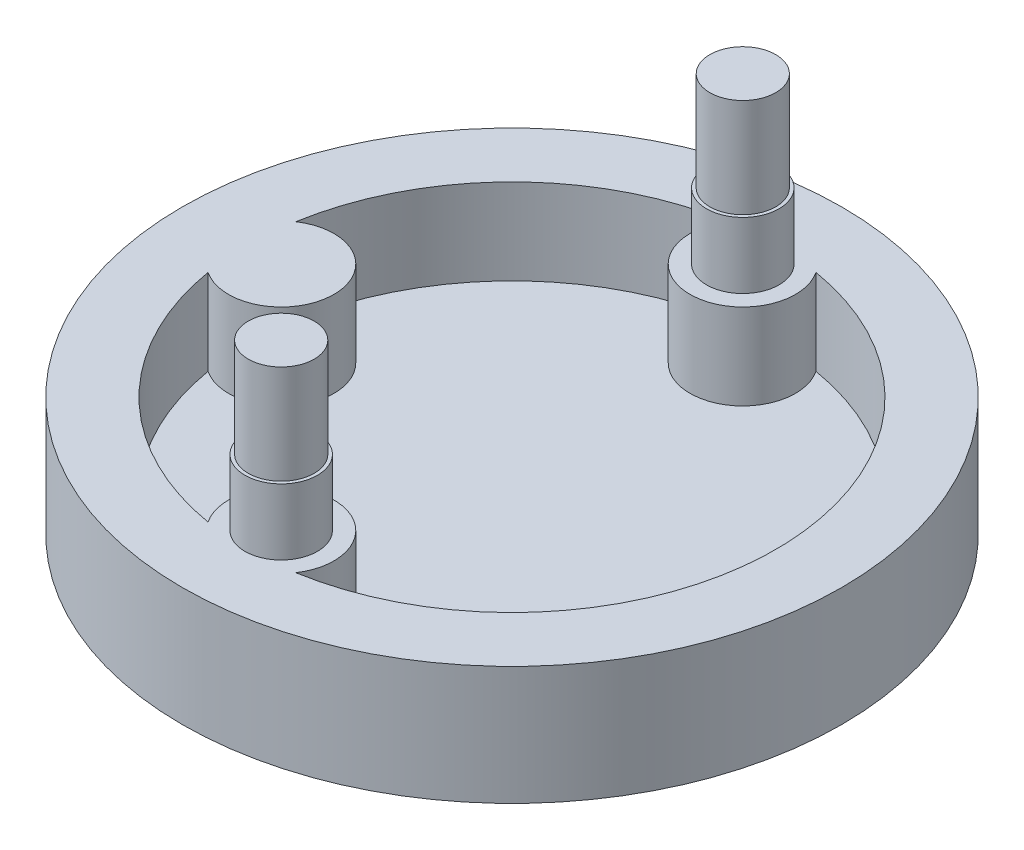
ISO-10303-21;
HEADER;
FILE_DESCRIPTION(('STEP AP214'),'2;1');
FILE_NAME('part.step','',(''),(''),'','','');
FILE_SCHEMA(('AUTOMOTIVE_DESIGN { 1 0 10303 214 1 1 1 1 }'));
ENDSEC;
DATA;
#1=APPLICATION_CONTEXT('core data for automotive mechanical design processes');
#2=APPLICATION_PROTOCOL_DEFINITION('international standard','automotive_design',2000,#1);
#3=PRODUCT_CONTEXT('',#1,'mechanical');
#4=PRODUCT('Part','Part','',(#3));
#5=PRODUCT_RELATED_PRODUCT_CATEGORY('part','',(#4));
#6=PRODUCT_DEFINITION_FORMATION('','',#4);
#7=PRODUCT_DEFINITION_CONTEXT('part definition',#1,'design');
#8=PRODUCT_DEFINITION('design','',#6,#7);
#9=PRODUCT_DEFINITION_SHAPE('','',#8);
#10=(LENGTH_UNIT() NAMED_UNIT(*) SI_UNIT(.MILLI.,.METRE.));
#11=(NAMED_UNIT(*) PLANE_ANGLE_UNIT() SI_UNIT($,.RADIAN.));
#12=(NAMED_UNIT(*) SI_UNIT($,.STERADIAN.) SOLID_ANGLE_UNIT());
#13=UNCERTAINTY_MEASURE_WITH_UNIT(LENGTH_MEASURE(1.E-05),#10,'distance_accuracy_value','');
#14=(GEOMETRIC_REPRESENTATION_CONTEXT(3) GLOBAL_UNCERTAINTY_ASSIGNED_CONTEXT((#13)) GLOBAL_UNIT_ASSIGNED_CONTEXT((#10,
#11,#12)) REPRESENTATION_CONTEXT('',''));
#15=CARTESIAN_POINT('',(0.,0.,0.));
#16=DIRECTION('',(0.,0.,1.));
#17=DIRECTION('',(1.,0.,0.));
#18=AXIS2_PLACEMENT_3D('',#15,#16,#17);
#19=CARTESIAN_POINT('',(0.,18.,0.));
#20=DIRECTION('',(0.,-1.,0.));
#21=DIRECTION('',(0.,0.,-1.));
#22=AXIS2_PLACEMENT_3D('',#19,#20,#21);
#23=CYLINDRICAL_SURFACE('',#22,40.);
#24=DIRECTION('',(0.,-1.,0.));
#25=VECTOR('',#24,1.);
#26=CARTESIAN_POINT('',(-39.4428571428571,11.5,-6.65289564085967));
#27=LINE('',#26,#25);
#28=CARTESIAN_POINT('',(-39.4428571428571,18.,-6.6528956408597));
#29=VERTEX_POINT('',#28);
#30=CARTESIAN_POINT('',(-39.4428571428571,5.,-6.6528956408597));
#31=VERTEX_POINT('',#30);
#32=EDGE_CURVE('E108',#29,#31,#27,.T.);
#33=ORIENTED_EDGE('',*,*,#32,.T.);
#34=CARTESIAN_POINT('',(0.,5.,0.));
#35=DIRECTION('',(0.,1.,0.));
#36=DIRECTION('',(0.,0.,1.));
#37=AXIS2_PLACEMENT_3D('',#34,#35,#36);
#38=CIRCLE('',#37,40.);
#39=CARTESIAN_POINT('',(-6.65289564085921,5.,-39.4428571428571));
#40=VERTEX_POINT('',#39);
#41=EDGE_CURVE('E96',#40,#31,#38,.T.);
#42=ORIENTED_EDGE('',*,*,#41,.F.);
#43=DIRECTION('',(0.,-1.,0.));
#44=VECTOR('',#43,1.);
#45=CARTESIAN_POINT('',(-6.65289564085919,11.5,-39.4428571428571));
#46=LINE('',#45,#44);
#47=CARTESIAN_POINT('',(-6.65289564085919,18.,-39.4428571428571));
#48=VERTEX_POINT('',#47);
#49=EDGE_CURVE('E144',#40,#48,#46,.F.);
#50=ORIENTED_EDGE('',*,*,#49,.T.);
#51=CARTESIAN_POINT('',(0.,18.,0.));
#52=DIRECTION('',(0.,1.,0.));
#53=DIRECTION('',(0.,0.,1.));
#54=AXIS2_PLACEMENT_3D('',#51,#52,#53);
#55=CIRCLE('',#54,40.);
#56=EDGE_CURVE('E65',#48,#29,#55,.T.);
#57=ORIENTED_EDGE('',*,*,#56,.T.);
#58=EDGE_LOOP('',(#33,#42,#50,#57));
#59=FACE_BOUND('',#58,.T.);
#60=ADVANCED_FACE('F39',(#59),#23,.F.);
#61=DIRECTION('',(0.,-1.,0.));
#62=VECTOR('',#61,1.);
#63=CARTESIAN_POINT('',(-39.4428571428571,11.5,6.65289564085968));
#64=LINE('',#63,#62);
#65=CARTESIAN_POINT('',(-39.4428571428571,5.,6.65289564085971));
#66=VERTEX_POINT('',#65);
#67=CARTESIAN_POINT('',(-39.4428571428571,18.,6.65289564085971));
#68=VERTEX_POINT('',#67);
#69=EDGE_CURVE('E57',#66,#68,#64,.F.);
#70=ORIENTED_EDGE('',*,*,#69,.T.);
#71=CARTESIAN_POINT('',(-6.65289564085951,18.,39.4428571428571));
#72=VERTEX_POINT('',#71);
#73=EDGE_CURVE('E151',#68,#72,#55,.T.);
#74=ORIENTED_EDGE('',*,*,#73,.T.);
#75=DIRECTION('',(0.,-1.,0.));
#76=VECTOR('',#75,1.);
#77=CARTESIAN_POINT('',(-6.65289564085951,11.5,39.4428571428571));
#78=LINE('',#77,#76);
#79=CARTESIAN_POINT('',(-6.65289564085951,5.,39.4428571428571));
#80=VERTEX_POINT('',#79);
#81=EDGE_CURVE('E122',#72,#80,#78,.T.);
#82=ORIENTED_EDGE('',*,*,#81,.T.);
#83=EDGE_CURVE('E105',#66,#80,#38,.T.);
#84=ORIENTED_EDGE('',*,*,#83,.F.);
#85=EDGE_LOOP('',(#70,#74,#82,#84));
#86=FACE_BOUND('',#85,.T.);
#87=ADVANCED_FACE('F176',(#86),#23,.F.);
#88=CARTESIAN_POINT('',(0.,18.,0.));
#89=DIRECTION('',(0.,-1.,0.));
#90=DIRECTION('',(0.,0.,-1.));
#91=AXIS2_PLACEMENT_3D('',#88,#89,#90);
#92=CYLINDRICAL_SURFACE('',#91,50.);
#93=CARTESIAN_POINT('',(0.,18.,0.));
#94=DIRECTION('',(0.,1.,0.));
#95=DIRECTION('',(0.,0.,1.));
#96=AXIS2_PLACEMENT_3D('',#93,#94,#95);
#97=CIRCLE('',#96,50.);
#98=CARTESIAN_POINT('',(0.,18.,50.));
#99=VERTEX_POINT('',#98);
#100=EDGE_CURVE('E152',#99,#99,#97,.T.);
#101=ORIENTED_EDGE('',*,*,#100,.F.);
#102=EDGE_LOOP('',(#101));
#103=FACE_BOUND('',#102,.T.);
#104=CARTESIAN_POINT('',(0.,0.,0.));
#105=DIRECTION('',(0.,1.,0.));
#106=DIRECTION('',(0.,0.,1.));
#107=AXIS2_PLACEMENT_3D('',#104,#105,#106);
#108=CIRCLE('',#107,50.);
#109=CARTESIAN_POINT('',(0.,0.,50.));
#110=VERTEX_POINT('',#109);
#111=EDGE_CURVE('E43',#110,#110,#108,.T.);
#112=ORIENTED_EDGE('',*,*,#111,.T.);
#113=EDGE_LOOP('',(#112));
#114=FACE_BOUND('',#113,.T.);
#115=ADVANCED_FACE('F41',(#103,#114),#92,.T.);
#116=CARTESIAN_POINT('',(0.,18.,0.));
#117=DIRECTION('',(0.,1.,0.));
#118=DIRECTION('',(0.,0.,1.));
#119=AXIS2_PLACEMENT_3D('',#116,#117,#118);
#120=PLANE('',#119);
#121=CARTESIAN_POINT('',(0.,18.,35.));
#122=DIRECTION('',(0.,1.,0.));
#123=DIRECTION('',(0.,0.,1.));
#124=AXIS2_PLACEMENT_3D('',#121,#122,#123);
#125=CIRCLE('',#124,5.5);
#126=CARTESIAN_POINT('',(0.,18.,40.5));
#127=VERTEX_POINT('',#126);
#128=EDGE_CURVE('E288',#127,#127,#125,.T.);
#129=ORIENTED_EDGE('',*,*,#128,.F.);
#130=EDGE_LOOP('',(#129));
#131=FACE_BOUND('',#130,.T.);
#132=CARTESIAN_POINT('',(0.,18.,-35.));
#133=DIRECTION('',(0.,1.,0.));
#134=DIRECTION('',(0.,0.,1.));
#135=AXIS2_PLACEMENT_3D('',#132,#133,#134);
#136=CIRCLE('',#135,5.5);
#137=CARTESIAN_POINT('',(0.,18.,-29.5));
#138=VERTEX_POINT('',#137);
#139=EDGE_CURVE('E294',#138,#138,#136,.T.);
#140=ORIENTED_EDGE('',*,*,#139,.F.);
#141=EDGE_LOOP('',(#140));
#142=FACE_BOUND('',#141,.T.);
#143=ORIENTED_EDGE('',*,*,#56,.F.);
#144=CARTESIAN_POINT('',(0.,18.,-35.));
#145=DIRECTION('',(0.,1.,0.));
#146=DIRECTION('',(0.,0.,1.));
#147=AXIS2_PLACEMENT_3D('',#144,#145,#146);
#148=CIRCLE('',#147,8.);
#149=CARTESIAN_POINT('',(6.65289564085919,18.,-39.4428571428571));
#150=VERTEX_POINT('',#149);
#151=EDGE_CURVE('E131',#48,#150,#148,.T.);
#152=ORIENTED_EDGE('',*,*,#151,.T.);
#153=CARTESIAN_POINT('',(6.65289564085951,18.,39.4428571428571));
#154=VERTEX_POINT('',#153);
#155=EDGE_CURVE('E104',#154,#150,#55,.T.);
#156=ORIENTED_EDGE('',*,*,#155,.F.);
#157=CARTESIAN_POINT('',(0.,18.,35.));
#158=DIRECTION('',(0.,1.,0.));
#159=DIRECTION('',(0.,0.,1.));
#160=AXIS2_PLACEMENT_3D('',#157,#158,#159);
#161=CIRCLE('',#160,8.00000000000024);
#162=EDGE_CURVE('E117',#154,#72,#161,.T.);
#163=ORIENTED_EDGE('',*,*,#162,.T.);
#164=ORIENTED_EDGE('',*,*,#73,.F.);
#165=CARTESIAN_POINT('',(-35.,18.,0.));
#166=DIRECTION('',(0.,1.,0.));
#167=DIRECTION('',(0.,0.,1.));
#168=AXIS2_PLACEMENT_3D('',#165,#166,#167);
#169=CIRCLE('',#168,8.00000000000036);
#170=EDGE_CURVE('E113',#68,#29,#169,.T.);
#171=ORIENTED_EDGE('',*,*,#170,.T.);
#172=EDGE_LOOP('',(#143,#152,#156,#163,#164,#171));
#173=FACE_BOUND('',#172,.T.);
#174=ORIENTED_EDGE('',*,*,#100,.T.);
#175=EDGE_LOOP('',(#174));
#176=FACE_BOUND('',#175,.T.);
#177=ADVANCED_FACE('F168',(#131,#142,#173,#176),#120,.T.);
#178=CARTESIAN_POINT('',(0.,0.,0.));
#179=DIRECTION('',(0.,1.,0.));
#180=DIRECTION('',(0.,0.,1.));
#181=AXIS2_PLACEMENT_3D('',#178,#179,#180);
#182=PLANE('',#181);
#183=CARTESIAN_POINT('',(-35.,0.,0.));
#184=DIRECTION('',(0.,-1.,0.));
#185=DIRECTION('',(0.,0.,-1.));
#186=AXIS2_PLACEMENT_3D('',#183,#184,#185);
#187=CIRCLE('',#186,4.);
#188=CARTESIAN_POINT('',(-35.,0.,-3.99999999999999));
#189=VERTEX_POINT('',#188);
#190=EDGE_CURVE('E260',#189,#189,#187,.T.);
#191=ORIENTED_EDGE('',*,*,#190,.F.);
#192=EDGE_LOOP('',(#191));
#193=FACE_BOUND('',#192,.T.);
#194=CARTESIAN_POINT('',(0.,0.,35.));
#195=DIRECTION('',(0.,-1.,0.));
#196=DIRECTION('',(0.,0.,-1.));
#197=AXIS2_PLACEMENT_3D('',#194,#195,#196);
#198=CIRCLE('',#197,4.);
#199=CARTESIAN_POINT('',(0.,0.,31.));
#200=VERTEX_POINT('',#199);
#201=EDGE_CURVE('E275',#200,#200,#198,.T.);
#202=ORIENTED_EDGE('',*,*,#201,.F.);
#203=EDGE_LOOP('',(#202));
#204=FACE_BOUND('',#203,.T.);
#205=CARTESIAN_POINT('',(0.,0.,-35.));
#206=DIRECTION('',(0.,-1.,0.));
#207=DIRECTION('',(0.,0.,-1.));
#208=AXIS2_PLACEMENT_3D('',#205,#206,#207);
#209=CIRCLE('',#208,4.);
#210=CARTESIAN_POINT('',(0.,0.,-39.));
#211=VERTEX_POINT('',#210);
#212=EDGE_CURVE('E259',#211,#211,#209,.T.);
#213=ORIENTED_EDGE('',*,*,#212,.F.);
#214=EDGE_LOOP('',(#213));
#215=FACE_BOUND('',#214,.T.);
#216=ORIENTED_EDGE('',*,*,#111,.F.);
#217=EDGE_LOOP('',(#216));
#218=FACE_BOUND('',#217,.T.);
#219=ADVANCED_FACE('F165',(#193,#204,#215,#218),#182,.F.);
#220=DIRECTION('',(0.,-1.,0.));
#221=VECTOR('',#220,1.);
#222=CARTESIAN_POINT('',(6.65289564085951,11.5,39.4428571428571));
#223=LINE('',#222,#221);
#224=CARTESIAN_POINT('',(6.65289564085951,5.,39.4428571428571));
#225=VERTEX_POINT('',#224);
#226=EDGE_CURVE('E132',#225,#154,#223,.F.);
#227=ORIENTED_EDGE('',*,*,#226,.T.);
#228=ORIENTED_EDGE('',*,*,#155,.T.);
#229=DIRECTION('',(0.,-1.,0.));
#230=VECTOR('',#229,1.);
#231=CARTESIAN_POINT('',(6.65289564085919,11.5,-39.4428571428571));
#232=LINE('',#231,#230);
#233=CARTESIAN_POINT('',(6.65289564085921,5.,-39.4428571428571));
#234=VERTEX_POINT('',#233);
#235=EDGE_CURVE('E141',#150,#234,#232,.T.);
#236=ORIENTED_EDGE('',*,*,#235,.T.);
#237=EDGE_CURVE('E107',#225,#234,#38,.T.);
#238=ORIENTED_EDGE('',*,*,#237,.F.);
#239=EDGE_LOOP('',(#227,#228,#236,#238));
#240=FACE_BOUND('',#239,.T.);
#241=ADVANCED_FACE('F167',(#240),#23,.F.);
#242=CARTESIAN_POINT('',(0.,5.,0.));
#243=DIRECTION('',(0.,1.,0.));
#244=DIRECTION('',(0.,0.,1.));
#245=AXIS2_PLACEMENT_3D('',#242,#243,#244);
#246=PLANE('',#245);
#247=CARTESIAN_POINT('',(-35.,5.,0.));
#248=DIRECTION('',(0.,1.,0.));
#249=DIRECTION('',(0.,0.,1.));
#250=AXIS2_PLACEMENT_3D('',#247,#248,#249);
#251=CIRCLE('',#250,8.00000000000036);
#252=EDGE_CURVE('E99',#31,#66,#251,.F.);
#253=ORIENTED_EDGE('',*,*,#252,.T.);
#254=ORIENTED_EDGE('',*,*,#83,.T.);
#255=CARTESIAN_POINT('',(0.,5.,35.));
#256=DIRECTION('',(0.,1.,0.));
#257=DIRECTION('',(0.,0.,1.));
#258=AXIS2_PLACEMENT_3D('',#255,#256,#257);
#259=CIRCLE('',#258,8.00000000000024);
#260=EDGE_CURVE('E128',#80,#225,#259,.F.);
#261=ORIENTED_EDGE('',*,*,#260,.T.);
#262=ORIENTED_EDGE('',*,*,#237,.T.);
#263=CARTESIAN_POINT('',(0.,5.,-35.));
#264=DIRECTION('',(0.,1.,0.));
#265=DIRECTION('',(0.,0.,1.));
#266=AXIS2_PLACEMENT_3D('',#263,#264,#265);
#267=CIRCLE('',#266,8.);
#268=EDGE_CURVE('E101',#234,#40,#267,.F.);
#269=ORIENTED_EDGE('',*,*,#268,.T.);
#270=ORIENTED_EDGE('',*,*,#41,.T.);
#271=EDGE_LOOP('',(#253,#254,#261,#262,#269,#270));
#272=FACE_BOUND('',#271,.T.);
#273=ADVANCED_FACE('F97',(#272),#246,.T.);
#274=CARTESIAN_POINT('',(0.,-0.00199999999999853,-35.));
#275=DIRECTION('',(0.,1.,0.));
#276=DIRECTION('',(0.,0.,1.));
#277=AXIS2_PLACEMENT_3D('',#274,#275,#276);
#278=CYLINDRICAL_SURFACE('',#277,8.);
#279=ORIENTED_EDGE('',*,*,#235,.F.);
#280=ORIENTED_EDGE('',*,*,#151,.F.);
#281=ORIENTED_EDGE('',*,*,#49,.F.);
#282=ORIENTED_EDGE('',*,*,#268,.F.);
#283=EDGE_LOOP('',(#279,#280,#281,#282));
#284=FACE_BOUND('',#283,.T.);
#285=ADVANCED_FACE('F188',(#284),#278,.T.);
#286=CARTESIAN_POINT('',(0.,-0.00199999999999853,35.));
#287=DIRECTION('',(0.,1.,0.));
#288=DIRECTION('',(0.,0.,1.));
#289=AXIS2_PLACEMENT_3D('',#286,#287,#288);
#290=CYLINDRICAL_SURFACE('',#289,8.00000000000024);
#291=ORIENTED_EDGE('',*,*,#81,.F.);
#292=ORIENTED_EDGE('',*,*,#162,.F.);
#293=ORIENTED_EDGE('',*,*,#226,.F.);
#294=ORIENTED_EDGE('',*,*,#260,.F.);
#295=EDGE_LOOP('',(#291,#292,#293,#294));
#296=FACE_BOUND('',#295,.T.);
#297=ADVANCED_FACE('F191',(#296),#290,.T.);
#298=CARTESIAN_POINT('',(-35.,-0.00199999999999853,0.));
#299=DIRECTION('',(0.,1.,0.));
#300=DIRECTION('',(0.,0.,1.));
#301=AXIS2_PLACEMENT_3D('',#298,#299,#300);
#302=CYLINDRICAL_SURFACE('',#301,8.00000000000036);
#303=ORIENTED_EDGE('',*,*,#32,.F.);
#304=ORIENTED_EDGE('',*,*,#170,.F.);
#305=ORIENTED_EDGE('',*,*,#69,.F.);
#306=ORIENTED_EDGE('',*,*,#252,.F.);
#307=EDGE_LOOP('',(#303,#304,#305,#306));
#308=FACE_BOUND('',#307,.T.);
#309=ADVANCED_FACE('F115',(#308),#302,.T.);
#310=CARTESIAN_POINT('',(0.,28.,-35.));
#311=DIRECTION('',(0.,-1.,0.));
#312=DIRECTION('',(0.,0.,-1.));
#313=AXIS2_PLACEMENT_3D('',#310,#311,#312);
#314=CYLINDRICAL_SURFACE('',#313,5.5);
#315=CARTESIAN_POINT('',(0.,28.,-35.));
#316=DIRECTION('',(0.,1.,0.));
#317=DIRECTION('',(0.,0.,1.));
#318=AXIS2_PLACEMENT_3D('',#315,#316,#317);
#319=CIRCLE('',#318,5.5);
#320=CARTESIAN_POINT('',(0.,28.,-29.5));
#321=VERTEX_POINT('',#320);
#322=EDGE_CURVE('E298',#321,#321,#319,.T.);
#323=ORIENTED_EDGE('',*,*,#322,.F.);
#324=EDGE_LOOP('',(#323));
#325=FACE_BOUND('',#324,.T.);
#326=ORIENTED_EDGE('',*,*,#139,.T.);
#327=EDGE_LOOP('',(#326));
#328=FACE_BOUND('',#327,.T.);
#329=ADVANCED_FACE('F198',(#325,#328),#314,.T.);
#330=CARTESIAN_POINT('',(0.,28.,-35.));
#331=DIRECTION('',(0.,1.,0.));
#332=DIRECTION('',(0.,0.,1.));
#333=AXIS2_PLACEMENT_3D('',#330,#331,#332);
#334=PLANE('',#333);
#335=CARTESIAN_POINT('',(0.,28.,-35.));
#336=DIRECTION('',(0.,1.,0.));
#337=DIRECTION('',(0.,0.,1.));
#338=AXIS2_PLACEMENT_3D('',#335,#336,#337);
#339=CIRCLE('',#338,5.);
#340=CARTESIAN_POINT('',(0.,28.,-30.));
#341=VERTEX_POINT('',#340);
#342=EDGE_CURVE('E11',#341,#341,#339,.T.);
#343=ORIENTED_EDGE('',*,*,#342,.F.);
#344=EDGE_LOOP('',(#343));
#345=FACE_BOUND('',#344,.T.);
#346=ORIENTED_EDGE('',*,*,#322,.T.);
#347=EDGE_LOOP('',(#346));
#348=FACE_BOUND('',#347,.T.);
#349=ADVANCED_FACE('F201',(#345,#348),#334,.T.);
#350=CARTESIAN_POINT('',(0.,28.,35.));
#351=DIRECTION('',(0.,-1.,0.));
#352=DIRECTION('',(0.,0.,-1.));
#353=AXIS2_PLACEMENT_3D('',#350,#351,#352);
#354=CYLINDRICAL_SURFACE('',#353,5.5);
#355=CARTESIAN_POINT('',(0.,28.,35.));
#356=DIRECTION('',(0.,1.,0.));
#357=DIRECTION('',(0.,0.,1.));
#358=AXIS2_PLACEMENT_3D('',#355,#356,#357);
#359=CIRCLE('',#358,5.5);
#360=CARTESIAN_POINT('',(0.,28.,40.5));
#361=VERTEX_POINT('',#360);
#362=EDGE_CURVE('E290',#361,#361,#359,.T.);
#363=ORIENTED_EDGE('',*,*,#362,.F.);
#364=EDGE_LOOP('',(#363));
#365=FACE_BOUND('',#364,.T.);
#366=ORIENTED_EDGE('',*,*,#128,.T.);
#367=EDGE_LOOP('',(#366));
#368=FACE_BOUND('',#367,.T.);
#369=ADVANCED_FACE('F205',(#365,#368),#354,.T.);
#370=CARTESIAN_POINT('',(0.,28.,35.));
#371=DIRECTION('',(0.,1.,0.));
#372=DIRECTION('',(0.,0.,1.));
#373=AXIS2_PLACEMENT_3D('',#370,#371,#372);
#374=PLANE('',#373);
#375=CARTESIAN_POINT('',(0.,28.,35.));
#376=DIRECTION('',(0.,1.,0.));
#377=DIRECTION('',(0.,0.,1.));
#378=AXIS2_PLACEMENT_3D('',#375,#376,#377);
#379=CIRCLE('',#378,5.);
#380=CARTESIAN_POINT('',(0.,28.,40.));
#381=VERTEX_POINT('',#380);
#382=EDGE_CURVE('E49',#381,#381,#379,.T.);
#383=ORIENTED_EDGE('',*,*,#382,.F.);
#384=EDGE_LOOP('',(#383));
#385=FACE_BOUND('',#384,.T.);
#386=ORIENTED_EDGE('',*,*,#362,.T.);
#387=EDGE_LOOP('',(#386));
#388=FACE_BOUND('',#387,.T.);
#389=ADVANCED_FACE('F209',(#385,#388),#374,.T.);
#390=CARTESIAN_POINT('',(0.,43.,35.));
#391=DIRECTION('',(0.,-1.,0.));
#392=DIRECTION('',(0.,0.,-1.));
#393=AXIS2_PLACEMENT_3D('',#390,#391,#392);
#394=CYLINDRICAL_SURFACE('',#393,5.);
#395=CARTESIAN_POINT('',(0.,43.,35.));
#396=DIRECTION('',(0.,1.,0.));
#397=DIRECTION('',(0.,0.,1.));
#398=AXIS2_PLACEMENT_3D('',#395,#396,#397);
#399=CIRCLE('',#398,5.);
#400=CARTESIAN_POINT('',(0.,43.,40.));
#401=VERTEX_POINT('',#400);
#402=EDGE_CURVE('E284',#401,#401,#399,.T.);
#403=ORIENTED_EDGE('',*,*,#402,.F.);
#404=EDGE_LOOP('',(#403));
#405=FACE_BOUND('',#404,.T.);
#406=ORIENTED_EDGE('',*,*,#382,.T.);
#407=EDGE_LOOP('',(#406));
#408=FACE_BOUND('',#407,.T.);
#409=ADVANCED_FACE('F213',(#405,#408),#394,.T.);
#410=CARTESIAN_POINT('',(0.,43.,35.));
#411=DIRECTION('',(0.,1.,0.));
#412=DIRECTION('',(0.,0.,1.));
#413=AXIS2_PLACEMENT_3D('',#410,#411,#412);
#414=PLANE('',#413);
#415=ORIENTED_EDGE('',*,*,#402,.T.);
#416=EDGE_LOOP('',(#415));
#417=FACE_BOUND('',#416,.T.);
#418=ADVANCED_FACE('F217',(#417),#414,.T.);
#419=CARTESIAN_POINT('',(0.,43.,-35.));
#420=DIRECTION('',(0.,-1.,0.));
#421=DIRECTION('',(0.,0.,-1.));
#422=AXIS2_PLACEMENT_3D('',#419,#420,#421);
#423=CYLINDRICAL_SURFACE('',#422,5.);
#424=CARTESIAN_POINT('',(0.,43.,-35.));
#425=DIRECTION('',(0.,1.,0.));
#426=DIRECTION('',(0.,0.,1.));
#427=AXIS2_PLACEMENT_3D('',#424,#425,#426);
#428=CIRCLE('',#427,5.);
#429=CARTESIAN_POINT('',(0.,43.,-30.));
#430=VERTEX_POINT('',#429);
#431=EDGE_CURVE('E274',#430,#430,#428,.T.);
#432=ORIENTED_EDGE('',*,*,#431,.F.);
#433=EDGE_LOOP('',(#432));
#434=FACE_BOUND('',#433,.T.);
#435=ORIENTED_EDGE('',*,*,#342,.T.);
#436=EDGE_LOOP('',(#435));
#437=FACE_BOUND('',#436,.T.);
#438=ADVANCED_FACE('F221',(#434,#437),#423,.T.);
#439=CARTESIAN_POINT('',(0.,43.,-35.));
#440=DIRECTION('',(0.,1.,0.));
#441=DIRECTION('',(0.,0.,1.));
#442=AXIS2_PLACEMENT_3D('',#439,#440,#441);
#443=PLANE('',#442);
#444=ORIENTED_EDGE('',*,*,#431,.T.);
#445=EDGE_LOOP('',(#444));
#446=FACE_BOUND('',#445,.T.);
#447=ADVANCED_FACE('F225',(#446),#443,.T.);
#448=CARTESIAN_POINT('',(0.,18.,-35.));
#449=DIRECTION('',(0.,-1.,0.));
#450=DIRECTION('',(0.,0.,-1.));
#451=AXIS2_PLACEMENT_3D('',#448,#449,#450);
#452=CYLINDRICAL_SURFACE('',#451,4.);
#453=CARTESIAN_POINT('',(0.,18.,-35.));
#454=DIRECTION('',(0.,-1.,0.));
#455=DIRECTION('',(0.,0.,-1.));
#456=AXIS2_PLACEMENT_3D('',#453,#454,#455);
#457=CIRCLE('',#456,4.);
#458=CARTESIAN_POINT('',(0.,18.,-39.));
#459=VERTEX_POINT('',#458);
#460=EDGE_CURVE('E265',#459,#459,#457,.T.);
#461=ORIENTED_EDGE('',*,*,#460,.F.);
#462=EDGE_LOOP('',(#461));
#463=FACE_BOUND('',#462,.T.);
#464=ORIENTED_EDGE('',*,*,#212,.T.);
#465=EDGE_LOOP('',(#464));
#466=FACE_BOUND('',#465,.T.);
#467=ADVANCED_FACE('F229',(#463,#466),#452,.F.);
#468=CARTESIAN_POINT('',(0.,18.,0.));
#469=DIRECTION('',(0.,-1.,0.));
#470=DIRECTION('',(0.,0.,-1.));
#471=AXIS2_PLACEMENT_3D('',#468,#469,#470);
#472=PLANE('',#471);
#473=ORIENTED_EDGE('',*,*,#460,.T.);
#474=EDGE_LOOP('',(#473));
#475=FACE_BOUND('',#474,.T.);
#476=ADVANCED_FACE('F233',(#475),#472,.T.);
#477=CARTESIAN_POINT('',(0.,18.,35.));
#478=DIRECTION('',(0.,-1.,0.));
#479=DIRECTION('',(0.,0.,-1.));
#480=AXIS2_PLACEMENT_3D('',#477,#478,#479);
#481=CYLINDRICAL_SURFACE('',#480,4.);
#482=CARTESIAN_POINT('',(0.,18.,35.));
#483=DIRECTION('',(0.,-1.,0.));
#484=DIRECTION('',(0.,0.,-1.));
#485=AXIS2_PLACEMENT_3D('',#482,#483,#484);
#486=CIRCLE('',#485,4.);
#487=CARTESIAN_POINT('',(0.,18.,31.));
#488=VERTEX_POINT('',#487);
#489=EDGE_CURVE('E270',#488,#488,#486,.T.);
#490=ORIENTED_EDGE('',*,*,#489,.F.);
#491=EDGE_LOOP('',(#490));
#492=FACE_BOUND('',#491,.T.);
#493=ORIENTED_EDGE('',*,*,#201,.T.);
#494=EDGE_LOOP('',(#493));
#495=FACE_BOUND('',#494,.T.);
#496=ADVANCED_FACE('F237',(#492,#495),#481,.F.);
#497=CARTESIAN_POINT('',(0.,18.,0.));
#498=DIRECTION('',(0.,-1.,0.));
#499=DIRECTION('',(0.,0.,-1.));
#500=AXIS2_PLACEMENT_3D('',#497,#498,#499);
#501=PLANE('',#500);
#502=ORIENTED_EDGE('',*,*,#489,.T.);
#503=EDGE_LOOP('',(#502));
#504=FACE_BOUND('',#503,.T.);
#505=ADVANCED_FACE('F241',(#504),#501,.T.);
#506=CARTESIAN_POINT('',(-35.,8.,0.));
#507=DIRECTION('',(0.,-1.,0.));
#508=DIRECTION('',(0.,0.,-1.));
#509=AXIS2_PLACEMENT_3D('',#506,#507,#508);
#510=CYLINDRICAL_SURFACE('',#509,4.);
#511=CARTESIAN_POINT('',(-35.,8.,0.));
#512=DIRECTION('',(0.,-1.,0.));
#513=DIRECTION('',(0.,0.,-1.));
#514=AXIS2_PLACEMENT_3D('',#511,#512,#513);
#515=CIRCLE('',#514,4.);
#516=CARTESIAN_POINT('',(-35.,8.,-3.99999999999999));
#517=VERTEX_POINT('',#516);
#518=EDGE_CURVE('E257',#517,#517,#515,.T.);
#519=ORIENTED_EDGE('',*,*,#518,.F.);
#520=EDGE_LOOP('',(#519));
#521=FACE_BOUND('',#520,.T.);
#522=ORIENTED_EDGE('',*,*,#190,.T.);
#523=EDGE_LOOP('',(#522));
#524=FACE_BOUND('',#523,.T.);
#525=ADVANCED_FACE('F245',(#521,#524),#510,.F.);
#526=CARTESIAN_POINT('',(0.,8.,0.));
#527=DIRECTION('',(0.,-1.,0.));
#528=DIRECTION('',(0.,0.,-1.));
#529=AXIS2_PLACEMENT_3D('',#526,#527,#528);
#530=PLANE('',#529);
#531=ORIENTED_EDGE('',*,*,#518,.T.);
#532=EDGE_LOOP('',(#531));
#533=FACE_BOUND('',#532,.T.);
#534=ADVANCED_FACE('F249',(#533),#530,.T.);
#535=CLOSED_SHELL('',(#60,#87,#115,#177,#219,#241,#273,#285,#297,#309,#329,#349,#369,#389,#409,
#418,#438,#447,#467,#476,#496,#505,#525,#534));
#536=MANIFOLD_SOLID_BREP('B2',#535);
#537=ADVANCED_BREP_SHAPE_REPRESENTATION('',(#18,#536),#14);
#538=SHAPE_DEFINITION_REPRESENTATION(#9,#537);
ENDSEC;
END-ISO-10303-21;
